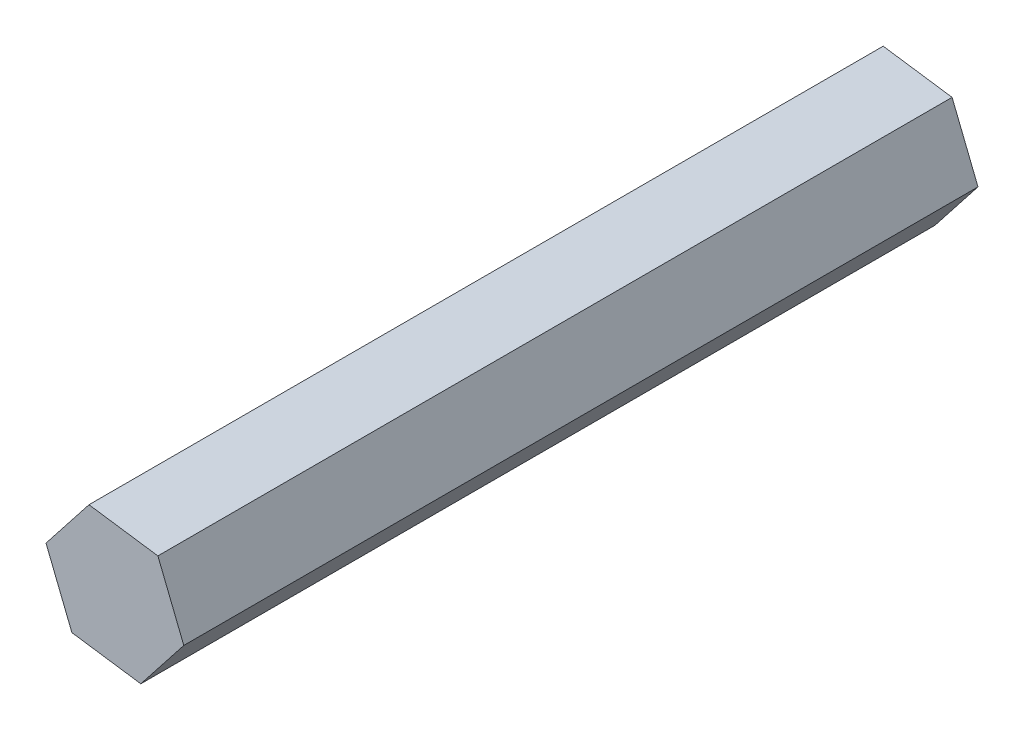
ISO-10303-21;
HEADER;
FILE_DESCRIPTION(('STEP AP214'),'2;1');
FILE_NAME('part.step','',(''),(''),'','','');
FILE_SCHEMA(('AUTOMOTIVE_DESIGN { 1 0 10303 214 1 1 1 1 }'));
ENDSEC;
DATA;
#1=APPLICATION_CONTEXT('core data for automotive mechanical design processes');
#2=APPLICATION_PROTOCOL_DEFINITION('international standard','automotive_design',2000,#1);
#3=PRODUCT_CONTEXT('',#1,'mechanical');
#4=PRODUCT('Part','Part','',(#3));
#5=PRODUCT_RELATED_PRODUCT_CATEGORY('part','',(#4));
#6=PRODUCT_DEFINITION_FORMATION('','',#4);
#7=PRODUCT_DEFINITION_CONTEXT('part definition',#1,'design');
#8=PRODUCT_DEFINITION('design','',#6,#7);
#9=PRODUCT_DEFINITION_SHAPE('','',#8);
#10=(LENGTH_UNIT() NAMED_UNIT(*) SI_UNIT(.MILLI.,.METRE.));
#11=(NAMED_UNIT(*) PLANE_ANGLE_UNIT() SI_UNIT($,.RADIAN.));
#12=(NAMED_UNIT(*) SI_UNIT($,.STERADIAN.) SOLID_ANGLE_UNIT());
#13=UNCERTAINTY_MEASURE_WITH_UNIT(LENGTH_MEASURE(1.E-05),#10,'distance_accuracy_value','');
#14=(GEOMETRIC_REPRESENTATION_CONTEXT(3) GLOBAL_UNCERTAINTY_ASSIGNED_CONTEXT((#13)) GLOBAL_UNIT_ASSIGNED_CONTEXT((#10,
#11,#12)) REPRESENTATION_CONTEXT('',''));
#15=CARTESIAN_POINT('',(0.,0.,0.));
#16=DIRECTION('',(0.,0.,1.));
#17=DIRECTION('',(1.,0.,0.));
#18=AXIS2_PLACEMENT_3D('',#15,#16,#17);
#19=CARTESIAN_POINT('',(7.25840803933825,-1.0386751502771,83.6679999999999));
#20=DIRECTION('',(-0.928120561057241,-0.372279765959408,0.));
#21=DIRECTION('',(0.372279765959408,-0.928120561057242,0.));
#22=AXIS2_PLACEMENT_3D('',#19,#20,#21);
#23=PLANE('',#22);
#24=DIRECTION('',(-0.372279765959408,0.928120561057241,0.));
#25=VECTOR('',#24,1.);
#26=CARTESIAN_POINT('',(7.25840803933825,-1.0386751502771,0.));
#27=LINE('',#26,#25);
#28=CARTESIAN_POINT('',(7.25840803933825,-1.0386751502771,0.));
#29=VERTEX_POINT('',#28);
#30=CARTESIAN_POINT('',(4.52872308608871,5.76662817796158,0.));
#31=VERTEX_POINT('',#30);
#32=EDGE_CURVE('E117',#29,#31,#27,.T.);
#33=ORIENTED_EDGE('',*,*,#32,.T.);
#34=DIRECTION('',(0.,0.,-1.));
#35=VECTOR('',#34,1.);
#36=CARTESIAN_POINT('',(4.52872308608871,5.76662817796158,83.6679999999999));
#37=LINE('',#36,#35);
#38=CARTESIAN_POINT('',(4.52872308608871,5.76662817796158,83.6679999999999));
#39=VERTEX_POINT('',#38);
#40=EDGE_CURVE('E11',#39,#31,#37,.T.);
#41=ORIENTED_EDGE('',*,*,#40,.F.);
#42=DIRECTION('',(-0.372279765959408,0.928120561057241,0.));
#43=VECTOR('',#42,1.);
#44=CARTESIAN_POINT('',(7.25840803933825,-1.0386751502771,83.6679999999999));
#45=LINE('',#44,#43);
#46=CARTESIAN_POINT('',(7.25840803933825,-1.0386751502771,83.6679999999999));
#47=VERTEX_POINT('',#46);
#48=EDGE_CURVE('E127',#47,#39,#45,.T.);
#49=ORIENTED_EDGE('',*,*,#48,.F.);
#50=DIRECTION('',(0.,0.,-1.));
#51=VECTOR('',#50,1.);
#52=CARTESIAN_POINT('',(7.25840803933825,-1.0386751502771,83.6679999999999));
#53=LINE('',#52,#51);
#54=EDGE_CURVE('E113',#47,#29,#53,.T.);
#55=ORIENTED_EDGE('',*,*,#54,.T.);
#56=EDGE_LOOP('',(#33,#41,#49,#55));
#57=FACE_BOUND('',#56,.T.);
#58=ADVANCED_FACE('F33',(#57),#23,.F.);
#59=CARTESIAN_POINT('',(4.52872308608871,5.76662817796158,83.6679999999999));
#60=DIRECTION('',(-0.141656545892849,-0.989915866629941,0.));
#61=DIRECTION('',(0.989915866629941,-0.141656545892849,0.));
#62=AXIS2_PLACEMENT_3D('',#59,#60,#61);
#63=PLANE('',#62);
#64=DIRECTION('',(-0.989915866629941,0.141656545892849,0.));
#65=VECTOR('',#64,1.);
#66=CARTESIAN_POINT('',(4.52872308608871,5.76662817796158,0.));
#67=LINE('',#66,#65);
#68=CARTESIAN_POINT('',(-2.72968495324954,6.80530332823868,0.));
#69=VERTEX_POINT('',#68);
#70=EDGE_CURVE('E120',#31,#69,#67,.T.);
#71=ORIENTED_EDGE('',*,*,#70,.T.);
#72=DIRECTION('',(0.,0.,-1.));
#73=VECTOR('',#72,1.);
#74=CARTESIAN_POINT('',(-2.72968495324954,6.80530332823868,83.6679999999999));
#75=LINE('',#74,#73);
#76=CARTESIAN_POINT('',(-2.72968495324954,6.80530332823868,83.6679999999999));
#77=VERTEX_POINT('',#76);
#78=EDGE_CURVE('E41',#77,#69,#75,.T.);
#79=ORIENTED_EDGE('',*,*,#78,.F.);
#80=DIRECTION('',(-0.989915866629941,0.141656545892849,0.));
#81=VECTOR('',#80,1.);
#82=CARTESIAN_POINT('',(4.52872308608871,5.76662817796158,83.6679999999999));
#83=LINE('',#82,#81);
#84=EDGE_CURVE('E86',#39,#77,#83,.T.);
#85=ORIENTED_EDGE('',*,*,#84,.F.);
#86=ORIENTED_EDGE('',*,*,#40,.T.);
#87=EDGE_LOOP('',(#71,#79,#85,#86));
#88=FACE_BOUND('',#87,.T.);
#89=ADVANCED_FACE('F151',(#88),#63,.F.);
#90=CARTESIAN_POINT('',(-2.72968495324954,6.80530332823868,83.6679999999999));
#91=DIRECTION('',(0.786464015164393,-0.617636100670533,0.));
#92=DIRECTION('',(0.617636100670534,0.786464015164393,0.));
#93=AXIS2_PLACEMENT_3D('',#90,#91,#92);
#94=PLANE('',#93);
#95=DIRECTION('',(-0.617636100670534,-0.786464015164393,0.));
#96=VECTOR('',#95,1.);
#97=CARTESIAN_POINT('',(-2.72968495324954,6.80530332823868,0.));
#98=LINE('',#97,#96);
#99=CARTESIAN_POINT('',(-7.25840803933825,1.0386751502771,0.));
#100=VERTEX_POINT('',#99);
#101=EDGE_CURVE('E122',#69,#100,#98,.T.);
#102=ORIENTED_EDGE('',*,*,#101,.T.);
#103=DIRECTION('',(0.,0.,-1.));
#104=VECTOR('',#103,1.);
#105=CARTESIAN_POINT('',(-7.25840803933825,1.0386751502771,83.6679999999999));
#106=LINE('',#105,#104);
#107=CARTESIAN_POINT('',(-7.25840803933825,1.0386751502771,83.6679999999999));
#108=VERTEX_POINT('',#107);
#109=EDGE_CURVE('E108',#108,#100,#106,.T.);
#110=ORIENTED_EDGE('',*,*,#109,.F.);
#111=DIRECTION('',(-0.617636100670534,-0.786464015164393,0.));
#112=VECTOR('',#111,1.);
#113=CARTESIAN_POINT('',(-2.72968495324954,6.80530332823868,83.6679999999999));
#114=LINE('',#113,#112);
#115=EDGE_CURVE('E99',#77,#108,#114,.T.);
#116=ORIENTED_EDGE('',*,*,#115,.F.);
#117=ORIENTED_EDGE('',*,*,#78,.T.);
#118=EDGE_LOOP('',(#102,#110,#116,#117));
#119=FACE_BOUND('',#118,.T.);
#120=ADVANCED_FACE('F133',(#119),#94,.F.);
#121=CARTESIAN_POINT('',(-7.25840803933825,1.0386751502771,83.6679999999999));
#122=DIRECTION('',(0.928120561057241,0.372279765959408,0.));
#123=DIRECTION('',(-0.372279765959408,0.928120561057241,0.));
#124=AXIS2_PLACEMENT_3D('',#121,#122,#123);
#125=PLANE('',#124);
#126=DIRECTION('',(0.372279765959407,-0.928120561057241,0.));
#127=VECTOR('',#126,1.);
#128=CARTESIAN_POINT('',(-7.25840803933825,1.0386751502771,0.));
#129=LINE('',#128,#127);
#130=CARTESIAN_POINT('',(-4.52872308608871,-5.76662817796157,0.));
#131=VERTEX_POINT('',#130);
#132=EDGE_CURVE('E107',#100,#131,#129,.T.);
#133=ORIENTED_EDGE('',*,*,#132,.T.);
#134=DIRECTION('',(0.,0.,-1.));
#135=VECTOR('',#134,1.);
#136=CARTESIAN_POINT('',(-4.52872308608871,-5.76662817796157,83.6679999999999));
#137=LINE('',#136,#135);
#138=CARTESIAN_POINT('',(-4.52872308608871,-5.76662817796157,83.6679999999999));
#139=VERTEX_POINT('',#138);
#140=EDGE_CURVE('E104',#139,#131,#137,.T.);
#141=ORIENTED_EDGE('',*,*,#140,.F.);
#142=DIRECTION('',(0.372279765959407,-0.928120561057241,0.));
#143=VECTOR('',#142,1.);
#144=CARTESIAN_POINT('',(-7.25840803933825,1.0386751502771,83.6679999999999));
#145=LINE('',#144,#143);
#146=EDGE_CURVE('E93',#108,#139,#145,.T.);
#147=ORIENTED_EDGE('',*,*,#146,.F.);
#148=ORIENTED_EDGE('',*,*,#109,.T.);
#149=EDGE_LOOP('',(#133,#141,#147,#148));
#150=FACE_BOUND('',#149,.T.);
#151=ADVANCED_FACE('F105',(#150),#125,.F.);
#152=CARTESIAN_POINT('',(-4.52872308608871,-5.76662817796157,83.6679999999999));
#153=DIRECTION('',(0.141656545892849,0.989915866629941,0.));
#154=DIRECTION('',(-0.989915866629941,0.141656545892849,0.));
#155=AXIS2_PLACEMENT_3D('',#152,#153,#154);
#156=PLANE('',#155);
#157=DIRECTION('',(0.989915866629941,-0.141656545892849,0.));
#158=VECTOR('',#157,1.);
#159=CARTESIAN_POINT('',(-4.52872308608871,-5.76662817796157,0.));
#160=LINE('',#159,#158);
#161=CARTESIAN_POINT('',(2.72968495324954,-6.80530332823868,0.));
#162=VERTEX_POINT('',#161);
#163=EDGE_CURVE('E72',#131,#162,#160,.T.);
#164=ORIENTED_EDGE('',*,*,#163,.T.);
#165=DIRECTION('',(0.,0.,-1.));
#166=VECTOR('',#165,1.);
#167=CARTESIAN_POINT('',(2.72968495324954,-6.80530332823868,83.6679999999999));
#168=LINE('',#167,#166);
#169=CARTESIAN_POINT('',(2.72968495324954,-6.80530332823868,83.6679999999999));
#170=VERTEX_POINT('',#169);
#171=EDGE_CURVE('E109',#170,#162,#168,.T.);
#172=ORIENTED_EDGE('',*,*,#171,.F.);
#173=DIRECTION('',(0.989915866629941,-0.141656545892849,0.));
#174=VECTOR('',#173,1.);
#175=CARTESIAN_POINT('',(-4.52872308608871,-5.76662817796157,83.6679999999999));
#176=LINE('',#175,#174);
#177=EDGE_CURVE('E97',#139,#170,#176,.T.);
#178=ORIENTED_EDGE('',*,*,#177,.F.);
#179=ORIENTED_EDGE('',*,*,#140,.T.);
#180=EDGE_LOOP('',(#164,#172,#178,#179));
#181=FACE_BOUND('',#180,.T.);
#182=ADVANCED_FACE('F111',(#181),#156,.F.);
#183=CARTESIAN_POINT('',(2.72968495324954,-6.80530332823868,83.6679999999999));
#184=DIRECTION('',(-0.786464015164393,0.617636100670534,0.));
#185=DIRECTION('',(-0.617636100670534,-0.786464015164393,0.));
#186=AXIS2_PLACEMENT_3D('',#183,#184,#185);
#187=PLANE('',#186);
#188=DIRECTION('',(0.617636100670534,0.786464015164393,0.));
#189=VECTOR('',#188,1.);
#190=CARTESIAN_POINT('',(2.72968495324954,-6.80530332823868,0.));
#191=LINE('',#190,#189);
#192=EDGE_CURVE('E78',#162,#29,#191,.T.);
#193=ORIENTED_EDGE('',*,*,#192,.T.);
#194=ORIENTED_EDGE('',*,*,#54,.F.);
#195=DIRECTION('',(0.617636100670534,0.786464015164393,0.));
#196=VECTOR('',#195,1.);
#197=CARTESIAN_POINT('',(2.72968495324954,-6.80530332823868,83.6679999999999));
#198=LINE('',#197,#196);
#199=EDGE_CURVE('E49',#170,#47,#198,.T.);
#200=ORIENTED_EDGE('',*,*,#199,.F.);
#201=ORIENTED_EDGE('',*,*,#171,.T.);
#202=EDGE_LOOP('',(#193,#194,#200,#201));
#203=FACE_BOUND('',#202,.T.);
#204=ADVANCED_FACE('F140',(#203),#187,.F.);
#205=CARTESIAN_POINT('',(0.,0.,83.6679999999999));
#206=DIRECTION('',(0.,0.,1.));
#207=DIRECTION('',(1.,0.,0.));
#208=AXIS2_PLACEMENT_3D('',#205,#206,#207);
#209=PLANE('',#208);
#210=ORIENTED_EDGE('',*,*,#48,.T.);
#211=ORIENTED_EDGE('',*,*,#84,.T.);
#212=ORIENTED_EDGE('',*,*,#115,.T.);
#213=ORIENTED_EDGE('',*,*,#146,.T.);
#214=ORIENTED_EDGE('',*,*,#177,.T.);
#215=ORIENTED_EDGE('',*,*,#199,.T.);
#216=EDGE_LOOP('',(#210,#211,#212,#213,#214,#215));
#217=FACE_BOUND('',#216,.T.);
#218=ADVANCED_FACE('F95',(#217),#209,.T.);
#219=CARTESIAN_POINT('',(0.,0.,0.));
#220=DIRECTION('',(0.,0.,1.));
#221=DIRECTION('',(1.,0.,0.));
#222=AXIS2_PLACEMENT_3D('',#219,#220,#221);
#223=PLANE('',#222);
#224=ORIENTED_EDGE('',*,*,#32,.F.);
#225=ORIENTED_EDGE('',*,*,#192,.F.);
#226=ORIENTED_EDGE('',*,*,#163,.F.);
#227=ORIENTED_EDGE('',*,*,#132,.F.);
#228=ORIENTED_EDGE('',*,*,#101,.F.);
#229=ORIENTED_EDGE('',*,*,#70,.F.);
#230=EDGE_LOOP('',(#224,#225,#226,#227,#228,#229));
#231=FACE_BOUND('',#230,.T.);
#232=ADVANCED_FACE('F136',(#231),#223,.F.);
#233=CLOSED_SHELL('',(#58,#89,#120,#151,#182,#204,#218,#232));
#234=MANIFOLD_SOLID_BREP('B2',#233);
#235=ADVANCED_BREP_SHAPE_REPRESENTATION('',(#18,#234),#14);
#236=SHAPE_DEFINITION_REPRESENTATION(#9,#235);
ENDSEC;
END-ISO-10303-21;
